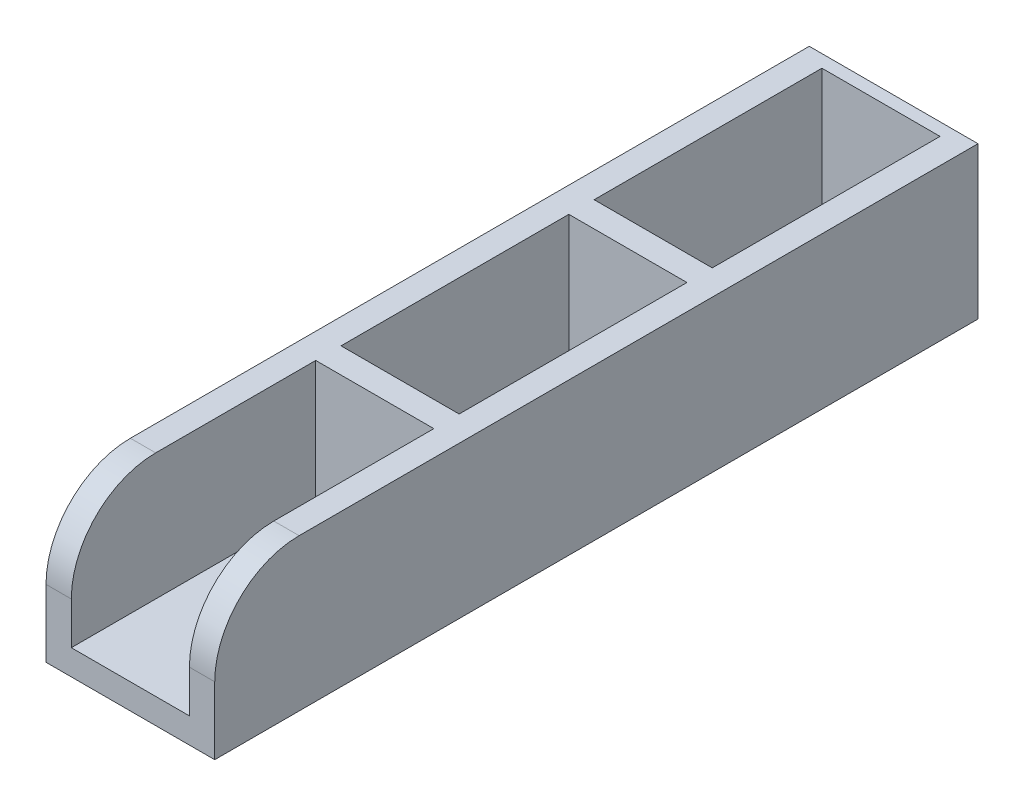
ISO-10303-21;
HEADER;
FILE_DESCRIPTION(('STEP AP214'),'2;1');
FILE_NAME('part.step','',(''),(''),'','','');
FILE_SCHEMA(('AUTOMOTIVE_DESIGN { 1 0 10303 214 1 1 1 1 }'));
ENDSEC;
DATA;
#1=APPLICATION_CONTEXT('core data for automotive mechanical design processes');
#2=APPLICATION_PROTOCOL_DEFINITION('international standard','automotive_design',2000,#1);
#3=PRODUCT_CONTEXT('',#1,'mechanical');
#4=PRODUCT('Part','Part','',(#3));
#5=PRODUCT_RELATED_PRODUCT_CATEGORY('part','',(#4));
#6=PRODUCT_DEFINITION_FORMATION('','',#4);
#7=PRODUCT_DEFINITION_CONTEXT('part definition',#1,'design');
#8=PRODUCT_DEFINITION('design','',#6,#7);
#9=PRODUCT_DEFINITION_SHAPE('','',#8);
#10=(LENGTH_UNIT() NAMED_UNIT(*) SI_UNIT(.MILLI.,.METRE.));
#11=(NAMED_UNIT(*) PLANE_ANGLE_UNIT() SI_UNIT($,.RADIAN.));
#12=(NAMED_UNIT(*) SI_UNIT($,.STERADIAN.) SOLID_ANGLE_UNIT());
#13=UNCERTAINTY_MEASURE_WITH_UNIT(LENGTH_MEASURE(1.E-05),#10,'distance_accuracy_value','');
#14=(GEOMETRIC_REPRESENTATION_CONTEXT(3) GLOBAL_UNCERTAINTY_ASSIGNED_CONTEXT((#13)) GLOBAL_UNIT_ASSIGNED_CONTEXT((#10,
#11,#12)) REPRESENTATION_CONTEXT('',''));
#15=CARTESIAN_POINT('',(0.,0.,0.));
#16=DIRECTION('',(0.,0.,1.));
#17=DIRECTION('',(1.,0.,0.));
#18=AXIS2_PLACEMENT_3D('',#15,#16,#17);
#19=CARTESIAN_POINT('',(0.,0.,78.5266096291886));
#20=DIRECTION('',(0.,0.,-1.));
#21=DIRECTION('',(-1.,0.,0.));
#22=AXIS2_PLACEMENT_3D('',#19,#20,#21);
#23=PLANE('',#22);
#24=DIRECTION('',(0.,-1.,0.));
#25=VECTOR('',#24,1.);
#26=CARTESIAN_POINT('',(10.,3.,78.5266096291886));
#27=LINE('',#26,#25);
#28=CARTESIAN_POINT('',(10.,18.,78.5266096291886));
#29=VERTEX_POINT('',#28);
#30=CARTESIAN_POINT('',(10.,0.,78.5266096291886));
#31=VERTEX_POINT('',#30);
#32=EDGE_CURVE('E182',#29,#31,#27,.T.);
#33=ORIENTED_EDGE('',*,*,#32,.T.);
#34=DIRECTION('',(-1.,0.,0.));
#35=VECTOR('',#34,1.);
#36=CARTESIAN_POINT('',(0.,0.,78.5266096291886));
#37=LINE('',#36,#35);
#38=CARTESIAN_POINT('',(-10.,0.,78.5266096291886));
#39=VERTEX_POINT('',#38);
#40=EDGE_CURVE('E192',#31,#39,#37,.T.);
#41=ORIENTED_EDGE('',*,*,#40,.T.);
#42=DIRECTION('',(0.,1.,0.));
#43=VECTOR('',#42,1.);
#44=CARTESIAN_POINT('',(-10.,3.,78.5266096291886));
#45=LINE('',#44,#43);
#46=CARTESIAN_POINT('',(-10.,18.,78.5266096291886));
#47=VERTEX_POINT('',#46);
#48=EDGE_CURVE('E199',#39,#47,#45,.T.);
#49=ORIENTED_EDGE('',*,*,#48,.T.);
#50=DIRECTION('',(-1.,0.,0.));
#51=VECTOR('',#50,1.);
#52=CARTESIAN_POINT('',(0.,18.,78.5266096291886));
#53=LINE('',#52,#51);
#54=EDGE_CURVE('E198',#29,#47,#53,.T.);
#55=ORIENTED_EDGE('',*,*,#54,.F.);
#56=EDGE_LOOP('',(#33,#41,#49,#55));
#57=FACE_BOUND('',#56,.T.);
#58=ADVANCED_FACE('F36',(#57),#23,.T.);
#59=CARTESIAN_POINT('',(0.,3.,0.));
#60=DIRECTION('',(0.,1.,0.));
#61=DIRECTION('',(0.,0.,1.));
#62=AXIS2_PLACEMENT_3D('',#59,#60,#61);
#63=PLANE('',#62);
#64=CARTESIAN_POINT('',(0.,3.,154.));
#65=DIRECTION('',(0.,1.,0.));
#66=DIRECTION('',(0.,0.,1.));
#67=AXIS2_PLACEMENT_3D('',#64,#65,#66);
#68=CIRCLE('',#67,3.49999999999998);
#69=CARTESIAN_POINT('',(0.,3.,157.5));
#70=VERTEX_POINT('',#69);
#71=EDGE_CURVE('E299',#70,#70,#68,.T.);
#72=ORIENTED_EDGE('',*,*,#71,.F.);
#73=EDGE_LOOP('',(#72));
#74=FACE_BOUND('',#73,.T.);
#75=DIRECTION('',(0.,0.,1.));
#76=VECTOR('',#75,1.);
#77=CARTESIAN_POINT('',(7.,3.,169.));
#78=LINE('',#77,#76);
#79=CARTESIAN_POINT('',(7.,3.,140.026609629189));
#80=VERTEX_POINT('',#79);
#81=CARTESIAN_POINT('',(7.,3.,169.));
#82=VERTEX_POINT('',#81);
#83=EDGE_CURVE('E214',#80,#82,#78,.T.);
#84=ORIENTED_EDGE('',*,*,#83,.F.);
#85=DIRECTION('',(1.,0.,0.));
#86=VECTOR('',#85,1.);
#87=CARTESIAN_POINT('',(7.,3.,140.026609629189));
#88=LINE('',#87,#86);
#89=CARTESIAN_POINT('',(-7.,3.,140.026609629189));
#90=VERTEX_POINT('',#89);
#91=EDGE_CURVE('E312',#90,#80,#88,.T.);
#92=ORIENTED_EDGE('',*,*,#91,.F.);
#93=DIRECTION('',(0.,0.,-1.));
#94=VECTOR('',#93,1.);
#95=CARTESIAN_POINT('',(-7.,3.,169.));
#96=LINE('',#95,#94);
#97=CARTESIAN_POINT('',(-7.,3.,169.));
#98=VERTEX_POINT('',#97);
#99=EDGE_CURVE('E40',#98,#90,#96,.T.);
#100=ORIENTED_EDGE('',*,*,#99,.F.);
#101=DIRECTION('',(-1.,0.,0.));
#102=VECTOR('',#101,1.);
#103=CARTESIAN_POINT('',(-10.,3.,169.));
#104=LINE('',#103,#102);
#105=EDGE_CURVE('E188',#82,#98,#104,.T.);
#106=ORIENTED_EDGE('',*,*,#105,.F.);
#107=EDGE_LOOP('',(#84,#92,#100,#106));
#108=FACE_BOUND('',#107,.T.);
#109=ADVANCED_FACE('F348',(#74,#108),#63,.T.);
#110=CARTESIAN_POINT('',(7.,3.,80.0266096291886));
#111=VERTEX_POINT('',#110);
#112=CARTESIAN_POINT('',(7.,3.,107.026609629189));
#113=VERTEX_POINT('',#112);
#114=EDGE_CURVE('E72',#111,#113,#78,.T.);
#115=ORIENTED_EDGE('',*,*,#114,.F.);
#116=DIRECTION('',(1.,0.,0.));
#117=VECTOR('',#116,1.);
#118=CARTESIAN_POINT('',(7.,3.,80.0266096291886));
#119=LINE('',#118,#117);
#120=CARTESIAN_POINT('',(-7.,3.,80.0266096291886));
#121=VERTEX_POINT('',#120);
#122=EDGE_CURVE('E11',#121,#111,#119,.T.);
#123=ORIENTED_EDGE('',*,*,#122,.F.);
#124=CARTESIAN_POINT('',(-7.,3.,107.026609629189));
#125=VERTEX_POINT('',#124);
#126=EDGE_CURVE('E227',#125,#121,#96,.T.);
#127=ORIENTED_EDGE('',*,*,#126,.F.);
#128=DIRECTION('',(-1.,0.,0.));
#129=VECTOR('',#128,1.);
#130=CARTESIAN_POINT('',(7.,3.,107.026609629189));
#131=LINE('',#130,#129);
#132=EDGE_CURVE('E254',#113,#125,#131,.T.);
#133=ORIENTED_EDGE('',*,*,#132,.F.);
#134=EDGE_LOOP('',(#115,#123,#127,#133));
#135=FACE_BOUND('',#134,.T.);
#136=ADVANCED_FACE('F322',(#135),#63,.T.);
#137=CARTESIAN_POINT('',(7.,3.,110.026609629189));
#138=VERTEX_POINT('',#137);
#139=CARTESIAN_POINT('',(7.,3.,137.026609629189));
#140=VERTEX_POINT('',#139);
#141=EDGE_CURVE('E213',#138,#140,#78,.T.);
#142=ORIENTED_EDGE('',*,*,#141,.F.);
#143=DIRECTION('',(1.,0.,0.));
#144=VECTOR('',#143,1.);
#145=CARTESIAN_POINT('',(7.,3.,110.026609629189));
#146=LINE('',#145,#144);
#147=CARTESIAN_POINT('',(-7.,3.,110.026609629189));
#148=VERTEX_POINT('',#147);
#149=EDGE_CURVE('E97',#148,#138,#146,.T.);
#150=ORIENTED_EDGE('',*,*,#149,.F.);
#151=CARTESIAN_POINT('',(-7.,3.,137.026609629189));
#152=VERTEX_POINT('',#151);
#153=EDGE_CURVE('E226',#152,#148,#96,.T.);
#154=ORIENTED_EDGE('',*,*,#153,.F.);
#155=DIRECTION('',(-1.,0.,0.));
#156=VECTOR('',#155,1.);
#157=CARTESIAN_POINT('',(7.,3.,137.026609629189));
#158=LINE('',#157,#156);
#159=EDGE_CURVE('E314',#140,#152,#158,.T.);
#160=ORIENTED_EDGE('',*,*,#159,.F.);
#161=EDGE_LOOP('',(#142,#150,#154,#160));
#162=FACE_BOUND('',#161,.T.);
#163=ADVANCED_FACE('F352',(#162),#63,.T.);
#164=CARTESIAN_POINT('',(0.,3.,154.));
#165=DIRECTION('',(0.,1.,0.));
#166=DIRECTION('',(0.,0.,1.));
#167=AXIS2_PLACEMENT_3D('',#164,#165,#166);
#168=CYLINDRICAL_SURFACE('',#167,3.49999999999998);
#169=ORIENTED_EDGE('',*,*,#71,.T.);
#170=EDGE_LOOP('',(#169));
#171=FACE_BOUND('',#170,.T.);
#172=CARTESIAN_POINT('',(0.,0.,154.));
#173=DIRECTION('',(0.,1.,0.));
#174=DIRECTION('',(0.,0.,1.));
#175=AXIS2_PLACEMENT_3D('',#172,#173,#174);
#176=CIRCLE('',#175,3.49999999999998);
#177=CARTESIAN_POINT('',(0.,0.,157.5));
#178=VERTEX_POINT('',#177);
#179=EDGE_CURVE('E296',#178,#178,#176,.T.);
#180=ORIENTED_EDGE('',*,*,#179,.F.);
#181=EDGE_LOOP('',(#180));
#182=FACE_BOUND('',#181,.T.);
#183=ADVANCED_FACE('F363',(#171,#182),#168,.F.);
#184=CARTESIAN_POINT('',(0.,0.,0.));
#185=DIRECTION('',(0.,1.,0.));
#186=DIRECTION('',(0.,0.,1.));
#187=AXIS2_PLACEMENT_3D('',#184,#185,#186);
#188=PLANE('',#187);
#189=ORIENTED_EDGE('',*,*,#179,.T.);
#190=EDGE_LOOP('',(#189));
#191=FACE_BOUND('',#190,.T.);
#192=ORIENTED_EDGE('',*,*,#40,.F.);
#193=DIRECTION('',(0.,0.,-1.));
#194=VECTOR('',#193,1.);
#195=CARTESIAN_POINT('',(10.,0.,169.));
#196=LINE('',#195,#194);
#197=CARTESIAN_POINT('',(10.,0.,169.));
#198=VERTEX_POINT('',#197);
#199=EDGE_CURVE('E177',#198,#31,#196,.T.);
#200=ORIENTED_EDGE('',*,*,#199,.F.);
#201=DIRECTION('',(1.,0.,0.));
#202=VECTOR('',#201,1.);
#203=CARTESIAN_POINT('',(-10.,0.,169.));
#204=LINE('',#203,#202);
#205=CARTESIAN_POINT('',(-10.,0.,169.));
#206=VERTEX_POINT('',#205);
#207=EDGE_CURVE('E289',#206,#198,#204,.T.);
#208=ORIENTED_EDGE('',*,*,#207,.F.);
#209=DIRECTION('',(0.,0.,-1.));
#210=VECTOR('',#209,1.);
#211=CARTESIAN_POINT('',(-10.,0.,169.));
#212=LINE('',#211,#210);
#213=EDGE_CURVE('E189',#206,#39,#212,.T.);
#214=ORIENTED_EDGE('',*,*,#213,.T.);
#215=EDGE_LOOP('',(#192,#200,#208,#214));
#216=FACE_BOUND('',#215,.T.);
#217=ADVANCED_FACE('F193',(#191,#216),#188,.F.);
#218=CARTESIAN_POINT('',(0.,0.,169.));
#219=DIRECTION('',(0.,0.,1.));
#220=DIRECTION('',(1.,0.,0.));
#221=AXIS2_PLACEMENT_3D('',#218,#219,#220);
#222=PLANE('',#221);
#223=DIRECTION('',(0.,-1.,0.));
#224=VECTOR('',#223,1.);
#225=CARTESIAN_POINT('',(-7.,18.,169.));
#226=LINE('',#225,#224);
#227=CARTESIAN_POINT('',(-7.,8.,169.));
#228=VERTEX_POINT('',#227);
#229=EDGE_CURVE('E218',#228,#98,#226,.T.);
#230=ORIENTED_EDGE('',*,*,#229,.F.);
#231=DIRECTION('',(1.,0.,0.));
#232=VECTOR('',#231,1.);
#233=CARTESIAN_POINT('',(-10.,8.,169.));
#234=LINE('',#233,#232);
#235=CARTESIAN_POINT('',(-10.,8.,169.));
#236=VERTEX_POINT('',#235);
#237=EDGE_CURVE('E279',#228,#236,#234,.F.);
#238=ORIENTED_EDGE('',*,*,#237,.T.);
#239=DIRECTION('',(0.,-1.,0.));
#240=VECTOR('',#239,1.);
#241=CARTESIAN_POINT('',(-10.,3.,169.));
#242=LINE('',#241,#240);
#243=EDGE_CURVE('E291',#236,#206,#242,.T.);
#244=ORIENTED_EDGE('',*,*,#243,.T.);
#245=ORIENTED_EDGE('',*,*,#207,.T.);
#246=DIRECTION('',(0.,1.,0.));
#247=VECTOR('',#246,1.);
#248=CARTESIAN_POINT('',(10.,3.,169.));
#249=LINE('',#248,#247);
#250=CARTESIAN_POINT('',(10.,8.,169.));
#251=VERTEX_POINT('',#250);
#252=EDGE_CURVE('E185',#198,#251,#249,.T.);
#253=ORIENTED_EDGE('',*,*,#252,.T.);
#254=DIRECTION('',(1.,0.,0.));
#255=VECTOR('',#254,1.);
#256=CARTESIAN_POINT('',(0.,8.,169.));
#257=LINE('',#256,#255);
#258=CARTESIAN_POINT('',(7.,8.,169.));
#259=VERTEX_POINT('',#258);
#260=EDGE_CURVE('E281',#251,#259,#257,.F.);
#261=ORIENTED_EDGE('',*,*,#260,.T.);
#262=DIRECTION('',(0.,-1.,0.));
#263=VECTOR('',#262,1.);
#264=CARTESIAN_POINT('',(7.,18.,169.));
#265=LINE('',#264,#263);
#266=EDGE_CURVE('E208',#259,#82,#265,.T.);
#267=ORIENTED_EDGE('',*,*,#266,.T.);
#268=ORIENTED_EDGE('',*,*,#105,.T.);
#269=EDGE_LOOP('',(#230,#238,#244,#245,#253,#261,#267,#268));
#270=FACE_BOUND('',#269,.T.);
#271=ADVANCED_FACE('F332',(#270),#222,.T.);
#272=CARTESIAN_POINT('',(0.,8.,159.));
#273=DIRECTION('',(1.,0.,0.));
#274=DIRECTION('',(0.,0.,-1.));
#275=AXIS2_PLACEMENT_3D('',#272,#273,#274);
#276=CYLINDRICAL_SURFACE('',#275,10.);
#277=CARTESIAN_POINT('',(7.,8.,159.));
#278=DIRECTION('',(1.,0.,0.));
#279=DIRECTION('',(0.,0.,-1.));
#280=AXIS2_PLACEMENT_3D('',#277,#278,#279);
#281=CIRCLE('',#280,10.);
#282=CARTESIAN_POINT('',(7.,18.,159.));
#283=VERTEX_POINT('',#282);
#284=EDGE_CURVE('E263',#259,#283,#281,.F.);
#285=ORIENTED_EDGE('',*,*,#284,.F.);
#286=ORIENTED_EDGE('',*,*,#260,.F.);
#287=CARTESIAN_POINT('',(10.,8.,159.));
#288=DIRECTION('',(-1.,0.,0.));
#289=DIRECTION('',(0.,0.,1.));
#290=AXIS2_PLACEMENT_3D('',#287,#288,#289);
#291=CIRCLE('',#290,10.);
#292=CARTESIAN_POINT('',(10.,18.,159.));
#293=VERTEX_POINT('',#292);
#294=EDGE_CURVE('E265',#293,#251,#291,.F.);
#295=ORIENTED_EDGE('',*,*,#294,.F.);
#296=DIRECTION('',(1.,0.,0.));
#297=VECTOR('',#296,1.);
#298=CARTESIAN_POINT('',(0.,18.,159.));
#299=LINE('',#298,#297);
#300=EDGE_CURVE('E272',#283,#293,#299,.T.);
#301=ORIENTED_EDGE('',*,*,#300,.F.);
#302=EDGE_LOOP('',(#285,#286,#295,#301));
#303=FACE_BOUND('',#302,.T.);
#304=ADVANCED_FACE('F333',(#303),#276,.T.);
#305=CARTESIAN_POINT('',(7.,18.,169.));
#306=DIRECTION('',(1.,0.,0.));
#307=DIRECTION('',(0.,0.,-1.));
#308=AXIS2_PLACEMENT_3D('',#305,#306,#307);
#309=PLANE('',#308);
#310=DIRECTION('',(0.,-1.,0.));
#311=VECTOR('',#310,1.);
#312=CARTESIAN_POINT('',(7.,18.,140.026609629189));
#313=LINE('',#312,#311);
#314=CARTESIAN_POINT('',(7.,18.,140.026609629189));
#315=VERTEX_POINT('',#314);
#316=EDGE_CURVE('E308',#315,#80,#313,.T.);
#317=ORIENTED_EDGE('',*,*,#316,.T.);
#318=ORIENTED_EDGE('',*,*,#83,.T.);
#319=ORIENTED_EDGE('',*,*,#266,.F.);
#320=ORIENTED_EDGE('',*,*,#284,.T.);
#321=DIRECTION('',(0.,0.,1.));
#322=VECTOR('',#321,1.);
#323=CARTESIAN_POINT('',(7.,18.,169.));
#324=LINE('',#323,#322);
#325=EDGE_CURVE('E209',#315,#283,#324,.T.);
#326=ORIENTED_EDGE('',*,*,#325,.F.);
#327=EDGE_LOOP('',(#317,#318,#319,#320,#326));
#328=FACE_BOUND('',#327,.T.);
#329=ADVANCED_FACE('F335',(#328),#309,.F.);
#330=CARTESIAN_POINT('',(7.,18.,140.026609629189));
#331=DIRECTION('',(0.,0.,-1.));
#332=DIRECTION('',(-1.,0.,0.));
#333=AXIS2_PLACEMENT_3D('',#330,#331,#332);
#334=PLANE('',#333);
#335=ORIENTED_EDGE('',*,*,#91,.T.);
#336=ORIENTED_EDGE('',*,*,#316,.F.);
#337=DIRECTION('',(1.,0.,0.));
#338=VECTOR('',#337,1.);
#339=CARTESIAN_POINT('',(7.,18.,140.026609629189));
#340=LINE('',#339,#338);
#341=CARTESIAN_POINT('',(-7.,18.,140.026609629189));
#342=VERTEX_POINT('',#341);
#343=EDGE_CURVE('E311',#342,#315,#340,.T.);
#344=ORIENTED_EDGE('',*,*,#343,.F.);
#345=DIRECTION('',(0.,-1.,0.));
#346=VECTOR('',#345,1.);
#347=CARTESIAN_POINT('',(-7.,18.,140.026609629189));
#348=LINE('',#347,#346);
#349=EDGE_CURVE('E306',#342,#90,#348,.T.);
#350=ORIENTED_EDGE('',*,*,#349,.T.);
#351=EDGE_LOOP('',(#335,#336,#344,#350));
#352=FACE_BOUND('',#351,.T.);
#353=ADVANCED_FACE('F341',(#352),#334,.F.);
#354=CARTESIAN_POINT('',(-7.,18.,169.));
#355=DIRECTION('',(-1.,0.,0.));
#356=DIRECTION('',(0.,0.,1.));
#357=AXIS2_PLACEMENT_3D('',#354,#355,#356);
#358=PLANE('',#357);
#359=ORIENTED_EDGE('',*,*,#349,.F.);
#360=DIRECTION('',(0.,0.,-1.));
#361=VECTOR('',#360,1.);
#362=CARTESIAN_POINT('',(-7.,18.,169.));
#363=LINE('',#362,#361);
#364=CARTESIAN_POINT('',(-7.,18.,159.));
#365=VERTEX_POINT('',#364);
#366=EDGE_CURVE('E215',#365,#342,#363,.T.);
#367=ORIENTED_EDGE('',*,*,#366,.F.);
#368=CARTESIAN_POINT('',(-7.,8.,159.));
#369=DIRECTION('',(-1.,0.,0.));
#370=DIRECTION('',(0.,0.,1.));
#371=AXIS2_PLACEMENT_3D('',#368,#369,#370);
#372=CIRCLE('',#371,10.);
#373=EDGE_CURVE('E283',#365,#228,#372,.F.);
#374=ORIENTED_EDGE('',*,*,#373,.T.);
#375=ORIENTED_EDGE('',*,*,#229,.T.);
#376=ORIENTED_EDGE('',*,*,#99,.T.);
#377=EDGE_LOOP('',(#359,#367,#374,#375,#376));
#378=FACE_BOUND('',#377,.T.);
#379=ADVANCED_FACE('F382',(#378),#358,.F.);
#380=CARTESIAN_POINT('',(0.,8.,159.));
#381=DIRECTION('',(-1.,0.,0.));
#382=DIRECTION('',(0.,0.,1.));
#383=AXIS2_PLACEMENT_3D('',#380,#381,#382);
#384=CYLINDRICAL_SURFACE('',#383,10.);
#385=CARTESIAN_POINT('',(-10.,8.,159.));
#386=DIRECTION('',(1.,0.,0.));
#387=DIRECTION('',(0.,0.,-1.));
#388=AXIS2_PLACEMENT_3D('',#385,#386,#387);
#389=CIRCLE('',#388,10.);
#390=CARTESIAN_POINT('',(-10.,18.,159.));
#391=VERTEX_POINT('',#390);
#392=EDGE_CURVE('E277',#236,#391,#389,.F.);
#393=ORIENTED_EDGE('',*,*,#392,.F.);
#394=ORIENTED_EDGE('',*,*,#237,.F.);
#395=ORIENTED_EDGE('',*,*,#373,.F.);
#396=DIRECTION('',(1.,0.,0.));
#397=VECTOR('',#396,1.);
#398=CARTESIAN_POINT('',(-7.,18.,159.));
#399=LINE('',#398,#397);
#400=EDGE_CURVE('E204',#391,#365,#399,.T.);
#401=ORIENTED_EDGE('',*,*,#400,.F.);
#402=EDGE_LOOP('',(#393,#394,#395,#401));
#403=FACE_BOUND('',#402,.T.);
#404=ADVANCED_FACE('F388',(#403),#384,.T.);
#405=CARTESIAN_POINT('',(-10.,3.,169.));
#406=DIRECTION('',(1.,0.,0.));
#407=DIRECTION('',(0.,0.,-1.));
#408=AXIS2_PLACEMENT_3D('',#405,#406,#407);
#409=PLANE('',#408);
#410=ORIENTED_EDGE('',*,*,#48,.F.);
#411=ORIENTED_EDGE('',*,*,#213,.F.);
#412=ORIENTED_EDGE('',*,*,#243,.F.);
#413=ORIENTED_EDGE('',*,*,#392,.T.);
#414=DIRECTION('',(0.,0.,1.));
#415=VECTOR('',#414,1.);
#416=CARTESIAN_POINT('',(-10.,18.,169.));
#417=LINE('',#416,#415);
#418=EDGE_CURVE('E220',#47,#391,#417,.T.);
#419=ORIENTED_EDGE('',*,*,#418,.F.);
#420=EDGE_LOOP('',(#410,#411,#412,#413,#419));
#421=FACE_BOUND('',#420,.T.);
#422=ADVANCED_FACE('F391',(#421),#409,.F.);
#423=CARTESIAN_POINT('',(10.,3.,169.));
#424=DIRECTION('',(-1.,0.,0.));
#425=DIRECTION('',(0.,0.,1.));
#426=AXIS2_PLACEMENT_3D('',#423,#424,#425);
#427=PLANE('',#426);
#428=ORIENTED_EDGE('',*,*,#32,.F.);
#429=DIRECTION('',(0.,0.,-1.));
#430=VECTOR('',#429,1.);
#431=CARTESIAN_POINT('',(10.,18.,169.));
#432=LINE('',#431,#430);
#433=EDGE_CURVE('E210',#293,#29,#432,.T.);
#434=ORIENTED_EDGE('',*,*,#433,.F.);
#435=ORIENTED_EDGE('',*,*,#294,.T.);
#436=ORIENTED_EDGE('',*,*,#252,.F.);
#437=ORIENTED_EDGE('',*,*,#199,.T.);
#438=EDGE_LOOP('',(#428,#434,#435,#436,#437));
#439=FACE_BOUND('',#438,.T.);
#440=ADVANCED_FACE('F179',(#439),#427,.F.);
#441=DIRECTION('',(0.,-1.,0.));
#442=VECTOR('',#441,1.);
#443=CARTESIAN_POINT('',(-7.,18.,80.0266096291886));
#444=LINE('',#443,#442);
#445=CARTESIAN_POINT('',(-7.,18.,80.0266096291886));
#446=VERTEX_POINT('',#445);
#447=EDGE_CURVE('E54',#446,#121,#444,.T.);
#448=ORIENTED_EDGE('',*,*,#447,.F.);
#449=CARTESIAN_POINT('',(-7.,18.,107.026609629189));
#450=VERTEX_POINT('',#449);
#451=EDGE_CURVE('E219',#450,#446,#363,.T.);
#452=ORIENTED_EDGE('',*,*,#451,.F.);
#453=DIRECTION('',(0.,-1.,0.));
#454=VECTOR('',#453,1.);
#455=CARTESIAN_POINT('',(-7.,18.,107.026609629189));
#456=LINE('',#455,#454);
#457=EDGE_CURVE('E245',#450,#125,#456,.T.);
#458=ORIENTED_EDGE('',*,*,#457,.T.);
#459=ORIENTED_EDGE('',*,*,#126,.T.);
#460=EDGE_LOOP('',(#448,#452,#458,#459));
#461=FACE_BOUND('',#460,.T.);
#462=ADVANCED_FACE('F325',(#461),#358,.F.);
#463=CARTESIAN_POINT('',(7.,18.,107.026609629189));
#464=DIRECTION('',(0.,0.,1.));
#465=DIRECTION('',(1.,0.,0.));
#466=AXIS2_PLACEMENT_3D('',#463,#464,#465);
#467=PLANE('',#466);
#468=ORIENTED_EDGE('',*,*,#132,.T.);
#469=ORIENTED_EDGE('',*,*,#457,.F.);
#470=DIRECTION('',(-1.,0.,0.));
#471=VECTOR('',#470,1.);
#472=CARTESIAN_POINT('',(7.,18.,107.026609629189));
#473=LINE('',#472,#471);
#474=CARTESIAN_POINT('',(7.,18.,107.026609629189));
#475=VERTEX_POINT('',#474);
#476=EDGE_CURVE('E255',#475,#450,#473,.T.);
#477=ORIENTED_EDGE('',*,*,#476,.F.);
#478=DIRECTION('',(0.,-1.,0.));
#479=VECTOR('',#478,1.);
#480=CARTESIAN_POINT('',(7.,18.,107.026609629189));
#481=LINE('',#480,#479);
#482=EDGE_CURVE('E249',#475,#113,#481,.T.);
#483=ORIENTED_EDGE('',*,*,#482,.T.);
#484=EDGE_LOOP('',(#468,#469,#477,#483));
#485=FACE_BOUND('',#484,.T.);
#486=ADVANCED_FACE('F319',(#485),#467,.F.);
#487=DIRECTION('',(0.,-1.,0.));
#488=VECTOR('',#487,1.);
#489=CARTESIAN_POINT('',(7.,18.,80.0266096291886));
#490=LINE('',#489,#488);
#491=CARTESIAN_POINT('',(7.,18.,80.0266096291886));
#492=VERTEX_POINT('',#491);
#493=EDGE_CURVE('E260',#492,#111,#490,.T.);
#494=ORIENTED_EDGE('',*,*,#493,.T.);
#495=ORIENTED_EDGE('',*,*,#114,.T.);
#496=ORIENTED_EDGE('',*,*,#482,.F.);
#497=EDGE_CURVE('E89',#492,#475,#324,.T.);
#498=ORIENTED_EDGE('',*,*,#497,.F.);
#499=EDGE_LOOP('',(#494,#495,#496,#498));
#500=FACE_BOUND('',#499,.T.);
#501=ADVANCED_FACE('F344',(#500),#309,.F.);
#502=CARTESIAN_POINT('',(7.,18.,80.0266096291886));
#503=DIRECTION('',(0.,0.,-1.));
#504=DIRECTION('',(-1.,0.,0.));
#505=AXIS2_PLACEMENT_3D('',#502,#503,#504);
#506=PLANE('',#505);
#507=ORIENTED_EDGE('',*,*,#122,.T.);
#508=ORIENTED_EDGE('',*,*,#493,.F.);
#509=DIRECTION('',(1.,0.,0.));
#510=VECTOR('',#509,1.);
#511=CARTESIAN_POINT('',(7.,18.,80.0266096291886));
#512=LINE('',#511,#510);
#513=EDGE_CURVE('E46',#446,#492,#512,.T.);
#514=ORIENTED_EDGE('',*,*,#513,.F.);
#515=ORIENTED_EDGE('',*,*,#447,.T.);
#516=EDGE_LOOP('',(#507,#508,#514,#515));
#517=FACE_BOUND('',#516,.T.);
#518=ADVANCED_FACE('F406',(#517),#506,.F.);
#519=DIRECTION('',(0.,-1.,0.));
#520=VECTOR('',#519,1.);
#521=CARTESIAN_POINT('',(-7.,18.,110.026609629189));
#522=LINE('',#521,#520);
#523=CARTESIAN_POINT('',(-7.,18.,110.026609629189));
#524=VERTEX_POINT('',#523);
#525=EDGE_CURVE('E243',#524,#148,#522,.T.);
#526=ORIENTED_EDGE('',*,*,#525,.F.);
#527=CARTESIAN_POINT('',(-7.,18.,137.026609629189));
#528=VERTEX_POINT('',#527);
#529=EDGE_CURVE('E217',#528,#524,#363,.T.);
#530=ORIENTED_EDGE('',*,*,#529,.F.);
#531=DIRECTION('',(0.,-1.,0.));
#532=VECTOR('',#531,1.);
#533=CARTESIAN_POINT('',(-7.,18.,137.026609629189));
#534=LINE('',#533,#532);
#535=EDGE_CURVE('E241',#528,#152,#534,.T.);
#536=ORIENTED_EDGE('',*,*,#535,.T.);
#537=ORIENTED_EDGE('',*,*,#153,.T.);
#538=EDGE_LOOP('',(#526,#530,#536,#537));
#539=FACE_BOUND('',#538,.T.);
#540=ADVANCED_FACE('F239',(#539),#358,.F.);
#541=CARTESIAN_POINT('',(7.,18.,137.026609629189));
#542=DIRECTION('',(0.,0.,1.));
#543=DIRECTION('',(1.,0.,0.));
#544=AXIS2_PLACEMENT_3D('',#541,#542,#543);
#545=PLANE('',#544);
#546=ORIENTED_EDGE('',*,*,#159,.T.);
#547=ORIENTED_EDGE('',*,*,#535,.F.);
#548=DIRECTION('',(-1.,0.,0.));
#549=VECTOR('',#548,1.);
#550=CARTESIAN_POINT('',(7.,18.,137.026609629189));
#551=LINE('',#550,#549);
#552=CARTESIAN_POINT('',(7.,18.,137.026609629189));
#553=VERTEX_POINT('',#552);
#554=EDGE_CURVE('E235',#553,#528,#551,.T.);
#555=ORIENTED_EDGE('',*,*,#554,.F.);
#556=DIRECTION('',(0.,-1.,0.));
#557=VECTOR('',#556,1.);
#558=CARTESIAN_POINT('',(7.,18.,137.026609629189));
#559=LINE('',#558,#557);
#560=EDGE_CURVE('E302',#553,#140,#559,.T.);
#561=ORIENTED_EDGE('',*,*,#560,.T.);
#562=EDGE_LOOP('',(#546,#547,#555,#561));
#563=FACE_BOUND('',#562,.T.);
#564=ADVANCED_FACE('F415',(#563),#545,.F.);
#565=DIRECTION('',(0.,-1.,0.));
#566=VECTOR('',#565,1.);
#567=CARTESIAN_POINT('',(7.,18.,110.026609629189));
#568=LINE('',#567,#566);
#569=CARTESIAN_POINT('',(7.,18.,110.026609629189));
#570=VERTEX_POINT('',#569);
#571=EDGE_CURVE('E244',#570,#138,#568,.T.);
#572=ORIENTED_EDGE('',*,*,#571,.T.);
#573=ORIENTED_EDGE('',*,*,#141,.T.);
#574=ORIENTED_EDGE('',*,*,#560,.F.);
#575=EDGE_CURVE('E207',#570,#553,#324,.T.);
#576=ORIENTED_EDGE('',*,*,#575,.F.);
#577=EDGE_LOOP('',(#572,#573,#574,#576));
#578=FACE_BOUND('',#577,.T.);
#579=ADVANCED_FACE('F343',(#578),#309,.F.);
#580=CARTESIAN_POINT('',(7.,18.,110.026609629189));
#581=DIRECTION('',(0.,0.,-1.));
#582=DIRECTION('',(-1.,0.,0.));
#583=AXIS2_PLACEMENT_3D('',#580,#581,#582);
#584=PLANE('',#583);
#585=ORIENTED_EDGE('',*,*,#149,.T.);
#586=ORIENTED_EDGE('',*,*,#571,.F.);
#587=DIRECTION('',(1.,0.,0.));
#588=VECTOR('',#587,1.);
#589=CARTESIAN_POINT('',(7.,18.,110.026609629189));
#590=LINE('',#589,#588);
#591=EDGE_CURVE('E233',#524,#570,#590,.T.);
#592=ORIENTED_EDGE('',*,*,#591,.F.);
#593=ORIENTED_EDGE('',*,*,#525,.T.);
#594=EDGE_LOOP('',(#585,#586,#592,#593));
#595=FACE_BOUND('',#594,.T.);
#596=ADVANCED_FACE('F327',(#595),#584,.F.);
#597=CARTESIAN_POINT('',(0.,18.,0.));
#598=DIRECTION('',(0.,1.,0.));
#599=DIRECTION('',(0.,0.,1.));
#600=AXIS2_PLACEMENT_3D('',#597,#598,#599);
#601=PLANE('',#600);
#602=ORIENTED_EDGE('',*,*,#591,.T.);
#603=ORIENTED_EDGE('',*,*,#575,.T.);
#604=ORIENTED_EDGE('',*,*,#554,.T.);
#605=ORIENTED_EDGE('',*,*,#529,.T.);
#606=EDGE_LOOP('',(#602,#603,#604,#605));
#607=FACE_BOUND('',#606,.T.);
#608=ORIENTED_EDGE('',*,*,#513,.T.);
#609=ORIENTED_EDGE('',*,*,#497,.T.);
#610=ORIENTED_EDGE('',*,*,#476,.T.);
#611=ORIENTED_EDGE('',*,*,#451,.T.);
#612=EDGE_LOOP('',(#608,#609,#610,#611));
#613=FACE_BOUND('',#612,.T.);
#614=ORIENTED_EDGE('',*,*,#433,.T.);
#615=ORIENTED_EDGE('',*,*,#54,.T.);
#616=ORIENTED_EDGE('',*,*,#418,.T.);
#617=ORIENTED_EDGE('',*,*,#400,.T.);
#618=ORIENTED_EDGE('',*,*,#366,.T.);
#619=ORIENTED_EDGE('',*,*,#343,.T.);
#620=ORIENTED_EDGE('',*,*,#325,.T.);
#621=ORIENTED_EDGE('',*,*,#300,.T.);
#622=EDGE_LOOP('',(#614,#615,#616,#617,#618,#619,#620,#621));
#623=FACE_BOUND('',#622,.T.);
#624=ADVANCED_FACE('F38',(#607,#613,#623),#601,.T.);
#625=CLOSED_SHELL('',(#58,#109,#136,#163,#183,#217,#271,#304,#329,#353,#379,#404,#422,#440,#462,
#486,#501,#518,#540,#564,#579,#596,#624));
#626=MANIFOLD_SOLID_BREP('B2',#625);
#627=ADVANCED_BREP_SHAPE_REPRESENTATION('',(#18,#626),#14);
#628=SHAPE_DEFINITION_REPRESENTATION(#9,#627);
ENDSEC;
END-ISO-10303-21;
